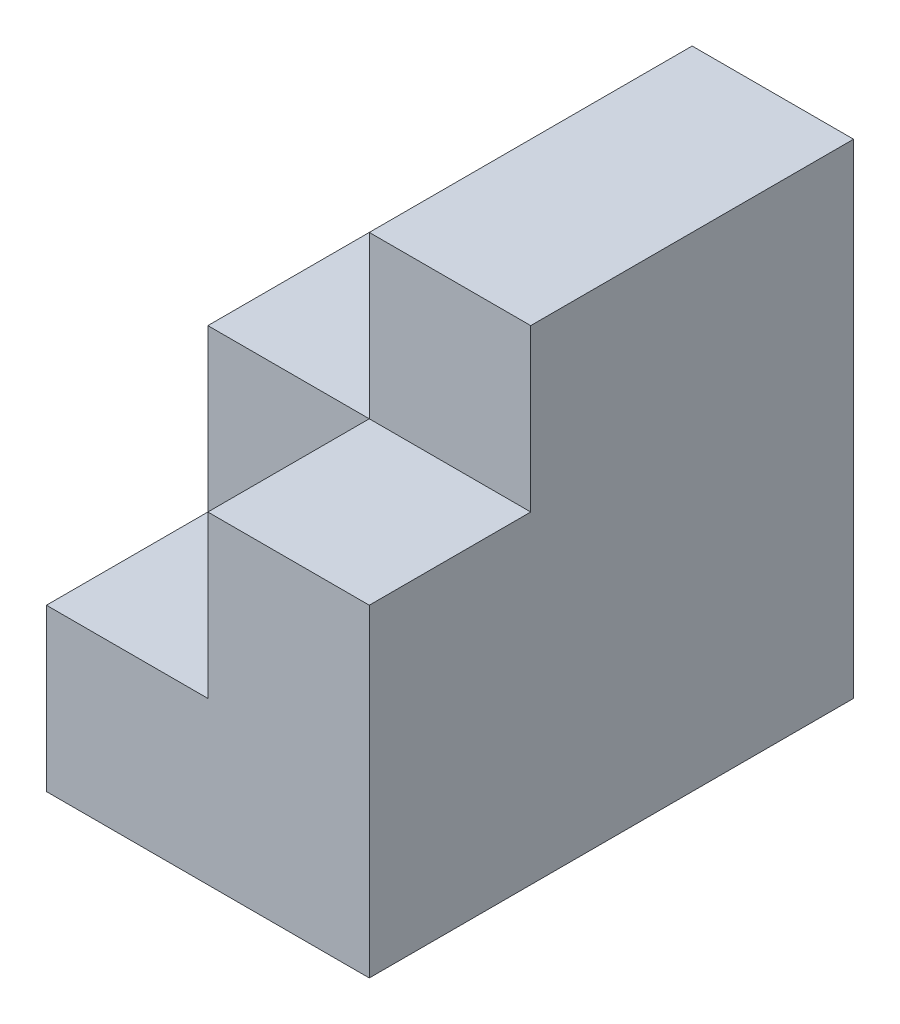
ISO-10303-21;
HEADER;
FILE_DESCRIPTION(('STEP AP214'),'2;1');
FILE_NAME('part.step','',(''),(''),'','','');
FILE_SCHEMA(('AUTOMOTIVE_DESIGN { 1 0 10303 214 1 1 1 1 }'));
ENDSEC;
DATA;
#1=APPLICATION_CONTEXT('core data for automotive mechanical design processes');
#2=APPLICATION_PROTOCOL_DEFINITION('international standard','automotive_design',2000,#1);
#3=PRODUCT_CONTEXT('',#1,'mechanical');
#4=PRODUCT('Part','Part','',(#3));
#5=PRODUCT_RELATED_PRODUCT_CATEGORY('part','',(#4));
#6=PRODUCT_DEFINITION_FORMATION('','',#4);
#7=PRODUCT_DEFINITION_CONTEXT('part definition',#1,'design');
#8=PRODUCT_DEFINITION('design','',#6,#7);
#9=PRODUCT_DEFINITION_SHAPE('','',#8);
#10=(LENGTH_UNIT() NAMED_UNIT(*) SI_UNIT(.MILLI.,.METRE.));
#11=(NAMED_UNIT(*) PLANE_ANGLE_UNIT() SI_UNIT($,.RADIAN.));
#12=(NAMED_UNIT(*) SI_UNIT($,.STERADIAN.) SOLID_ANGLE_UNIT());
#13=UNCERTAINTY_MEASURE_WITH_UNIT(LENGTH_MEASURE(1.E-05),#10,'distance_accuracy_value','');
#14=(GEOMETRIC_REPRESENTATION_CONTEXT(3) GLOBAL_UNCERTAINTY_ASSIGNED_CONTEXT((#13)) GLOBAL_UNIT_ASSIGNED_CONTEXT((#10,
#11,#12)) REPRESENTATION_CONTEXT('',''));
#15=CARTESIAN_POINT('',(0.,0.,0.));
#16=DIRECTION('',(0.,0.,1.));
#17=DIRECTION('',(1.,0.,0.));
#18=AXIS2_PLACEMENT_3D('',#15,#16,#17);
#19=CARTESIAN_POINT('',(0.,40.,0.));
#20=DIRECTION('',(0.,-1.,0.));
#21=DIRECTION('',(0.,0.,-1.));
#22=AXIS2_PLACEMENT_3D('',#19,#20,#21);
#23=PLANE('',#22);
#24=DIRECTION('',(1.,0.,0.));
#25=VECTOR('',#24,1.);
#26=CARTESIAN_POINT('',(40.,40.,40.));
#27=LINE('',#26,#25);
#28=CARTESIAN_POINT('',(40.,40.,40.));
#29=VERTEX_POINT('',#28);
#30=CARTESIAN_POINT('',(60.,40.,40.));
#31=VERTEX_POINT('',#30);
#32=EDGE_CURVE('E59',#29,#31,#27,.T.);
#33=ORIENTED_EDGE('',*,*,#32,.F.);
#34=DIRECTION('',(0.,0.,1.));
#35=VECTOR('',#34,1.);
#36=CARTESIAN_POINT('',(40.,40.,0.));
#37=LINE('',#36,#35);
#38=CARTESIAN_POINT('',(40.,40.,60.));
#39=VERTEX_POINT('',#38);
#40=EDGE_CURVE('E146',#29,#39,#37,.T.);
#41=ORIENTED_EDGE('',*,*,#40,.T.);
#42=DIRECTION('',(1.,0.,0.));
#43=VECTOR('',#42,1.);
#44=CARTESIAN_POINT('',(60.,40.,60.));
#45=LINE('',#44,#43);
#46=CARTESIAN_POINT('',(60.,40.,60.));
#47=VERTEX_POINT('',#46);
#48=EDGE_CURVE('E160',#39,#47,#45,.T.);
#49=ORIENTED_EDGE('',*,*,#48,.T.);
#50=DIRECTION('',(0.,0.,-1.));
#51=VECTOR('',#50,1.);
#52=CARTESIAN_POINT('',(60.,40.,0.));
#53=LINE('',#52,#51);
#54=EDGE_CURVE('E151',#47,#31,#53,.T.);
#55=ORIENTED_EDGE('',*,*,#54,.T.);
#56=EDGE_LOOP('',(#33,#41,#49,#55));
#57=FACE_BOUND('',#56,.T.);
#58=ADVANCED_FACE('F43',(#57),#23,.F.);
#59=CARTESIAN_POINT('',(0.,20.,20.));
#60=DIRECTION('',(0.,-1.,0.));
#61=DIRECTION('',(0.,0.,-1.));
#62=AXIS2_PLACEMENT_3D('',#59,#60,#61);
#63=PLANE('',#62);
#64=DIRECTION('',(0.,0.,1.));
#65=VECTOR('',#64,1.);
#66=CARTESIAN_POINT('',(40.,20.,0.));
#67=LINE('',#66,#65);
#68=CARTESIAN_POINT('',(40.,20.,0.));
#69=VERTEX_POINT('',#68);
#70=CARTESIAN_POINT('',(40.,20.,60.));
#71=VERTEX_POINT('',#70);
#72=EDGE_CURVE('E67',#69,#71,#67,.T.);
#73=ORIENTED_EDGE('',*,*,#72,.F.);
#74=DIRECTION('',(-1.,0.,0.));
#75=VECTOR('',#74,1.);
#76=CARTESIAN_POINT('',(0.,20.,0.));
#77=LINE('',#76,#75);
#78=CARTESIAN_POINT('',(0.,20.,0.));
#79=VERTEX_POINT('',#78);
#80=EDGE_CURVE('E202',#69,#79,#77,.T.);
#81=ORIENTED_EDGE('',*,*,#80,.T.);
#82=DIRECTION('',(0.,0.,-1.));
#83=VECTOR('',#82,1.);
#84=CARTESIAN_POINT('',(0.,20.,20.));
#85=LINE('',#84,#83);
#86=CARTESIAN_POINT('',(0.,20.,20.));
#87=VERTEX_POINT('',#86);
#88=EDGE_CURVE('E208',#87,#79,#85,.T.);
#89=ORIENTED_EDGE('',*,*,#88,.F.);
#90=DIRECTION('',(-1.,0.,0.));
#91=VECTOR('',#90,1.);
#92=CARTESIAN_POINT('',(0.,20.,20.));
#93=LINE('',#92,#91);
#94=CARTESIAN_POINT('',(20.,20.,20.));
#95=VERTEX_POINT('',#94);
#96=EDGE_CURVE('E205',#95,#87,#93,.T.);
#97=ORIENTED_EDGE('',*,*,#96,.F.);
#98=DIRECTION('',(0.,0.,-1.));
#99=VECTOR('',#98,1.);
#100=CARTESIAN_POINT('',(20.,20.,60.));
#101=LINE('',#100,#99);
#102=CARTESIAN_POINT('',(20.,20.,60.));
#103=VERTEX_POINT('',#102);
#104=EDGE_CURVE('E192',#103,#95,#101,.T.);
#105=ORIENTED_EDGE('',*,*,#104,.F.);
#106=DIRECTION('',(-1.,0.,0.));
#107=VECTOR('',#106,1.);
#108=CARTESIAN_POINT('',(60.,20.,60.));
#109=LINE('',#108,#107);
#110=EDGE_CURVE('E175',#71,#103,#109,.T.);
#111=ORIENTED_EDGE('',*,*,#110,.F.);
#112=EDGE_LOOP('',(#73,#81,#89,#97,#105,#111));
#113=FACE_BOUND('',#112,.T.);
#114=ADVANCED_FACE('F252',(#113),#63,.F.);
#115=CARTESIAN_POINT('',(0.,0.,20.));
#116=DIRECTION('',(0.,0.,-1.));
#117=DIRECTION('',(-1.,0.,0.));
#118=AXIS2_PLACEMENT_3D('',#115,#116,#117);
#119=PLANE('',#118);
#120=DIRECTION('',(0.,-1.,0.));
#121=VECTOR('',#120,1.);
#122=CARTESIAN_POINT('',(20.,0.,20.));
#123=LINE('',#122,#121);
#124=CARTESIAN_POINT('',(20.,0.,20.));
#125=VERTEX_POINT('',#124);
#126=EDGE_CURVE('E171',#95,#125,#123,.T.);
#127=ORIENTED_EDGE('',*,*,#126,.F.);
#128=ORIENTED_EDGE('',*,*,#96,.T.);
#129=DIRECTION('',(0.,-1.,0.));
#130=VECTOR('',#129,1.);
#131=CARTESIAN_POINT('',(0.,0.,20.));
#132=LINE('',#131,#130);
#133=CARTESIAN_POINT('',(0.,0.,20.));
#134=VERTEX_POINT('',#133);
#135=EDGE_CURVE('E197',#87,#134,#132,.T.);
#136=ORIENTED_EDGE('',*,*,#135,.T.);
#137=DIRECTION('',(1.,0.,0.));
#138=VECTOR('',#137,1.);
#139=CARTESIAN_POINT('',(0.,0.,20.));
#140=LINE('',#139,#138);
#141=EDGE_CURVE('E201',#134,#125,#140,.T.);
#142=ORIENTED_EDGE('',*,*,#141,.T.);
#143=EDGE_LOOP('',(#127,#128,#136,#142));
#144=FACE_BOUND('',#143,.T.);
#145=ADVANCED_FACE('F250',(#144),#119,.F.);
#146=CARTESIAN_POINT('',(0.,0.,20.));
#147=DIRECTION('',(1.,0.,0.));
#148=DIRECTION('',(0.,0.,-1.));
#149=AXIS2_PLACEMENT_3D('',#146,#147,#148);
#150=PLANE('',#149);
#151=DIRECTION('',(0.,-1.,0.));
#152=VECTOR('',#151,1.);
#153=CARTESIAN_POINT('',(0.,0.,0.));
#154=LINE('',#153,#152);
#155=CARTESIAN_POINT('',(0.,0.,0.));
#156=VERTEX_POINT('',#155);
#157=EDGE_CURVE('E196',#79,#156,#154,.T.);
#158=ORIENTED_EDGE('',*,*,#157,.T.);
#159=DIRECTION('',(0.,0.,-1.));
#160=VECTOR('',#159,1.);
#161=CARTESIAN_POINT('',(0.,0.,20.));
#162=LINE('',#161,#160);
#163=EDGE_CURVE('E11',#134,#156,#162,.T.);
#164=ORIENTED_EDGE('',*,*,#163,.F.);
#165=ORIENTED_EDGE('',*,*,#135,.F.);
#166=ORIENTED_EDGE('',*,*,#88,.T.);
#167=EDGE_LOOP('',(#158,#164,#165,#166));
#168=FACE_BOUND('',#167,.T.);
#169=ADVANCED_FACE('F45',(#168),#150,.F.);
#170=CARTESIAN_POINT('',(0.,0.,20.));
#171=DIRECTION('',(0.,1.,0.));
#172=DIRECTION('',(0.,0.,1.));
#173=AXIS2_PLACEMENT_3D('',#170,#171,#172);
#174=PLANE('',#173);
#175=DIRECTION('',(1.,0.,0.));
#176=VECTOR('',#175,1.);
#177=CARTESIAN_POINT('',(0.,0.,0.));
#178=LINE('',#177,#176);
#179=CARTESIAN_POINT('',(60.,0.,0.));
#180=VERTEX_POINT('',#179);
#181=EDGE_CURVE('E212',#156,#180,#178,.T.);
#182=ORIENTED_EDGE('',*,*,#181,.T.);
#183=DIRECTION('',(0.,0.,-1.));
#184=VECTOR('',#183,1.);
#185=CARTESIAN_POINT('',(60.,0.,20.));
#186=LINE('',#185,#184);
#187=CARTESIAN_POINT('',(60.,0.,60.));
#188=VERTEX_POINT('',#187);
#189=EDGE_CURVE('E52',#188,#180,#186,.T.);
#190=ORIENTED_EDGE('',*,*,#189,.F.);
#191=DIRECTION('',(1.,0.,0.));
#192=VECTOR('',#191,1.);
#193=CARTESIAN_POINT('',(60.,0.,60.));
#194=LINE('',#193,#192);
#195=CARTESIAN_POINT('',(20.,0.,60.));
#196=VERTEX_POINT('',#195);
#197=EDGE_CURVE('E181',#196,#188,#194,.T.);
#198=ORIENTED_EDGE('',*,*,#197,.F.);
#199=DIRECTION('',(0.,0.,-1.));
#200=VECTOR('',#199,1.);
#201=CARTESIAN_POINT('',(20.,0.,60.));
#202=LINE('',#201,#200);
#203=EDGE_CURVE('E185',#196,#125,#202,.T.);
#204=ORIENTED_EDGE('',*,*,#203,.T.);
#205=ORIENTED_EDGE('',*,*,#141,.F.);
#206=ORIENTED_EDGE('',*,*,#163,.T.);
#207=EDGE_LOOP('',(#182,#190,#198,#204,#205,#206));
#208=FACE_BOUND('',#207,.T.);
#209=ADVANCED_FACE('F244',(#208),#174,.F.);
#210=CARTESIAN_POINT('',(60.,0.,20.));
#211=DIRECTION('',(-1.,0.,0.));
#212=DIRECTION('',(0.,0.,1.));
#213=AXIS2_PLACEMENT_3D('',#210,#211,#212);
#214=PLANE('',#213);
#215=DIRECTION('',(0.,1.,0.));
#216=VECTOR('',#215,1.);
#217=CARTESIAN_POINT('',(60.,0.,0.));
#218=LINE('',#217,#216);
#219=CARTESIAN_POINT('',(60.,60.,0.));
#220=VERTEX_POINT('',#219);
#221=EDGE_CURVE('E215',#180,#220,#218,.T.);
#222=ORIENTED_EDGE('',*,*,#221,.T.);
#223=DIRECTION('',(0.,0.,-1.));
#224=VECTOR('',#223,1.);
#225=CARTESIAN_POINT('',(60.,60.,0.));
#226=LINE('',#225,#224);
#227=CARTESIAN_POINT('',(60.,60.,40.));
#228=VERTEX_POINT('',#227);
#229=EDGE_CURVE('E132',#228,#220,#226,.T.);
#230=ORIENTED_EDGE('',*,*,#229,.F.);
#231=DIRECTION('',(0.,-1.,0.));
#232=VECTOR('',#231,1.);
#233=CARTESIAN_POINT('',(60.,60.,40.));
#234=LINE('',#233,#232);
#235=EDGE_CURVE('E127',#228,#31,#234,.T.);
#236=ORIENTED_EDGE('',*,*,#235,.T.);
#237=ORIENTED_EDGE('',*,*,#54,.F.);
#238=DIRECTION('',(0.,1.,0.));
#239=VECTOR('',#238,1.);
#240=CARTESIAN_POINT('',(60.,0.,60.));
#241=LINE('',#240,#239);
#242=EDGE_CURVE('E172',#188,#47,#241,.T.);
#243=ORIENTED_EDGE('',*,*,#242,.F.);
#244=ORIENTED_EDGE('',*,*,#189,.T.);
#245=EDGE_LOOP('',(#222,#230,#236,#237,#243,#244));
#246=FACE_BOUND('',#245,.T.);
#247=ADVANCED_FACE('F227',(#246),#214,.F.);
#248=CARTESIAN_POINT('',(0.,0.,0.));
#249=DIRECTION('',(0.,0.,-1.));
#250=DIRECTION('',(-1.,0.,0.));
#251=AXIS2_PLACEMENT_3D('',#248,#249,#250);
#252=PLANE('',#251);
#253=ORIENTED_EDGE('',*,*,#157,.F.);
#254=ORIENTED_EDGE('',*,*,#80,.F.);
#255=DIRECTION('',(0.,-1.,0.));
#256=VECTOR('',#255,1.);
#257=CARTESIAN_POINT('',(40.,40.,0.));
#258=LINE('',#257,#256);
#259=CARTESIAN_POINT('',(40.,60.,0.));
#260=VERTEX_POINT('',#259);
#261=EDGE_CURVE('E168',#260,#69,#258,.T.);
#262=ORIENTED_EDGE('',*,*,#261,.F.);
#263=DIRECTION('',(-1.,0.,0.));
#264=VECTOR('',#263,1.);
#265=CARTESIAN_POINT('',(40.,60.,0.));
#266=LINE('',#265,#264);
#267=EDGE_CURVE('E139',#220,#260,#266,.T.);
#268=ORIENTED_EDGE('',*,*,#267,.F.);
#269=ORIENTED_EDGE('',*,*,#221,.F.);
#270=ORIENTED_EDGE('',*,*,#181,.F.);
#271=EDGE_LOOP('',(#253,#254,#262,#268,#269,#270));
#272=FACE_BOUND('',#271,.T.);
#273=ADVANCED_FACE('F233',(#272),#252,.T.);
#274=CARTESIAN_POINT('',(20.,0.,60.));
#275=DIRECTION('',(1.,0.,0.));
#276=DIRECTION('',(0.,0.,-1.));
#277=AXIS2_PLACEMENT_3D('',#274,#275,#276);
#278=PLANE('',#277);
#279=ORIENTED_EDGE('',*,*,#126,.T.);
#280=ORIENTED_EDGE('',*,*,#203,.F.);
#281=DIRECTION('',(0.,-1.,0.));
#282=VECTOR('',#281,1.);
#283=CARTESIAN_POINT('',(20.,0.,60.));
#284=LINE('',#283,#282);
#285=EDGE_CURVE('E178',#103,#196,#284,.T.);
#286=ORIENTED_EDGE('',*,*,#285,.F.);
#287=ORIENTED_EDGE('',*,*,#104,.T.);
#288=EDGE_LOOP('',(#279,#280,#286,#287));
#289=FACE_BOUND('',#288,.T.);
#290=ADVANCED_FACE('F246',(#289),#278,.F.);
#291=CARTESIAN_POINT('',(0.,0.,60.));
#292=DIRECTION('',(0.,0.,1.));
#293=DIRECTION('',(1.,0.,0.));
#294=AXIS2_PLACEMENT_3D('',#291,#292,#293);
#295=PLANE('',#294);
#296=ORIENTED_EDGE('',*,*,#242,.T.);
#297=ORIENTED_EDGE('',*,*,#48,.F.);
#298=DIRECTION('',(0.,-1.,0.));
#299=VECTOR('',#298,1.);
#300=CARTESIAN_POINT('',(40.,40.,60.));
#301=LINE('',#300,#299);
#302=EDGE_CURVE('E163',#39,#71,#301,.T.);
#303=ORIENTED_EDGE('',*,*,#302,.T.);
#304=ORIENTED_EDGE('',*,*,#110,.T.);
#305=ORIENTED_EDGE('',*,*,#285,.T.);
#306=ORIENTED_EDGE('',*,*,#197,.T.);
#307=EDGE_LOOP('',(#296,#297,#303,#304,#305,#306));
#308=FACE_BOUND('',#307,.T.);
#309=ADVANCED_FACE('F241',(#308),#295,.T.);
#310=CARTESIAN_POINT('',(40.,40.,0.));
#311=DIRECTION('',(1.,0.,0.));
#312=DIRECTION('',(0.,0.,-1.));
#313=AXIS2_PLACEMENT_3D('',#310,#311,#312);
#314=PLANE('',#313);
#315=ORIENTED_EDGE('',*,*,#72,.T.);
#316=ORIENTED_EDGE('',*,*,#302,.F.);
#317=ORIENTED_EDGE('',*,*,#40,.F.);
#318=DIRECTION('',(0.,-1.,0.));
#319=VECTOR('',#318,1.);
#320=CARTESIAN_POINT('',(40.,60.,40.));
#321=LINE('',#320,#319);
#322=CARTESIAN_POINT('',(40.,60.,40.));
#323=VERTEX_POINT('',#322);
#324=EDGE_CURVE('E125',#323,#29,#321,.T.);
#325=ORIENTED_EDGE('',*,*,#324,.F.);
#326=DIRECTION('',(0.,0.,1.));
#327=VECTOR('',#326,1.);
#328=CARTESIAN_POINT('',(40.,60.,0.));
#329=LINE('',#328,#327);
#330=EDGE_CURVE('E133',#260,#323,#329,.T.);
#331=ORIENTED_EDGE('',*,*,#330,.F.);
#332=ORIENTED_EDGE('',*,*,#261,.T.);
#333=EDGE_LOOP('',(#315,#316,#317,#325,#331,#332));
#334=FACE_BOUND('',#333,.T.);
#335=ADVANCED_FACE('F144',(#334),#314,.F.);
#336=CARTESIAN_POINT('',(40.,60.,40.));
#337=DIRECTION('',(0.,0.,-1.));
#338=DIRECTION('',(-1.,0.,0.));
#339=AXIS2_PLACEMENT_3D('',#336,#337,#338);
#340=PLANE('',#339);
#341=ORIENTED_EDGE('',*,*,#32,.T.);
#342=ORIENTED_EDGE('',*,*,#235,.F.);
#343=DIRECTION('',(1.,0.,0.));
#344=VECTOR('',#343,1.);
#345=CARTESIAN_POINT('',(40.,60.,40.));
#346=LINE('',#345,#344);
#347=EDGE_CURVE('E121',#323,#228,#346,.T.);
#348=ORIENTED_EDGE('',*,*,#347,.F.);
#349=ORIENTED_EDGE('',*,*,#324,.T.);
#350=EDGE_LOOP('',(#341,#342,#348,#349));
#351=FACE_BOUND('',#350,.T.);
#352=ADVANCED_FACE('F123',(#351),#340,.F.);
#353=CARTESIAN_POINT('',(0.,60.,0.));
#354=DIRECTION('',(0.,1.,0.));
#355=DIRECTION('',(0.,0.,1.));
#356=AXIS2_PLACEMENT_3D('',#353,#354,#355);
#357=PLANE('',#356);
#358=ORIENTED_EDGE('',*,*,#330,.T.);
#359=ORIENTED_EDGE('',*,*,#347,.T.);
#360=ORIENTED_EDGE('',*,*,#229,.T.);
#361=ORIENTED_EDGE('',*,*,#267,.T.);
#362=EDGE_LOOP('',(#358,#359,#360,#361));
#363=FACE_BOUND('',#362,.T.);
#364=ADVANCED_FACE('F137',(#363),#357,.T.);
#365=CLOSED_SHELL('',(#58,#114,#145,#169,#209,#247,#273,#290,#309,#335,#352,#364));
#366=MANIFOLD_SOLID_BREP('B2',#365);
#367=ADVANCED_BREP_SHAPE_REPRESENTATION('',(#18,#366),#14);
#368=SHAPE_DEFINITION_REPRESENTATION(#9,#367);
ENDSEC;
END-ISO-10303-21;
